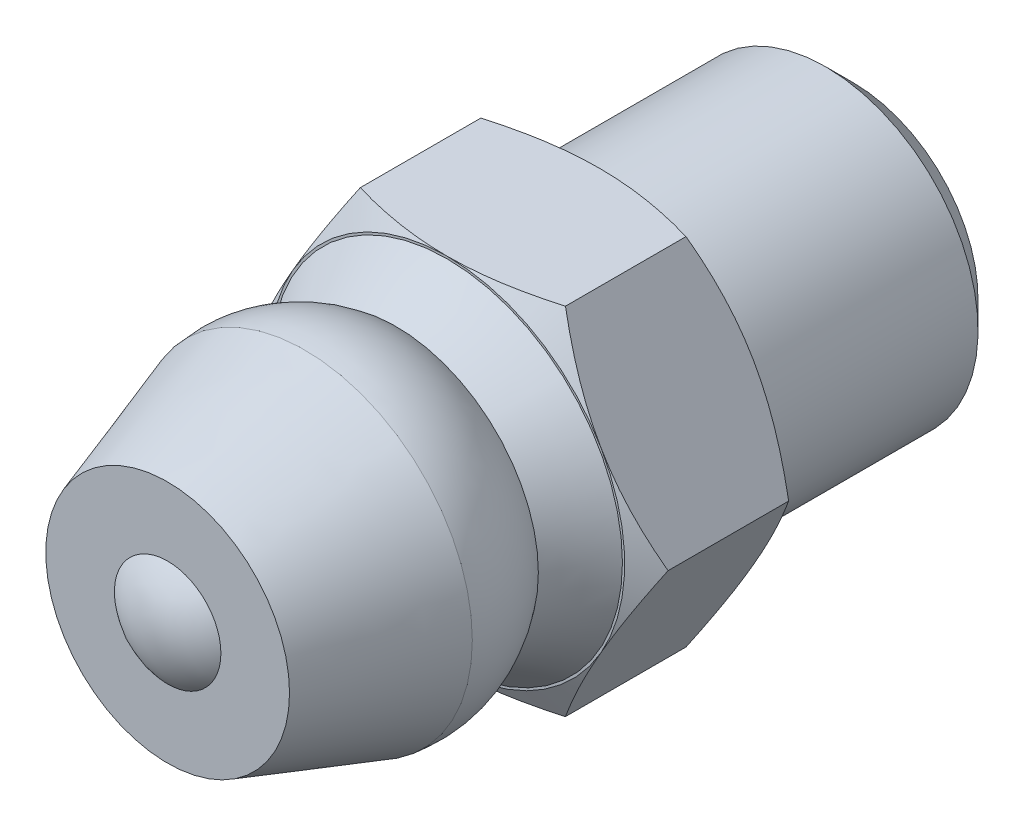
ISO-10303-21;
HEADER;
FILE_DESCRIPTION(('STEP AP214'),'2;1');
FILE_NAME('part.step','',(''),(''),'','','');
FILE_SCHEMA(('AUTOMOTIVE_DESIGN { 1 0 10303 214 1 1 1 1 }'));
ENDSEC;
DATA;
#1=APPLICATION_CONTEXT('core data for automotive mechanical design processes');
#2=APPLICATION_PROTOCOL_DEFINITION('international standard','automotive_design',2000,#1);
#3=PRODUCT_CONTEXT('',#1,'mechanical');
#4=PRODUCT('Part','Part','',(#3));
#5=PRODUCT_RELATED_PRODUCT_CATEGORY('part','',(#4));
#6=PRODUCT_DEFINITION_FORMATION('','',#4);
#7=PRODUCT_DEFINITION_CONTEXT('part definition',#1,'design');
#8=PRODUCT_DEFINITION('design','',#6,#7);
#9=PRODUCT_DEFINITION_SHAPE('','',#8);
#10=(LENGTH_UNIT() NAMED_UNIT(*) SI_UNIT(.MILLI.,.METRE.));
#11=(NAMED_UNIT(*) PLANE_ANGLE_UNIT() SI_UNIT($,.RADIAN.));
#12=(NAMED_UNIT(*) SI_UNIT($,.STERADIAN.) SOLID_ANGLE_UNIT());
#13=UNCERTAINTY_MEASURE_WITH_UNIT(LENGTH_MEASURE(1.E-05),#10,'distance_accuracy_value','');
#14=(GEOMETRIC_REPRESENTATION_CONTEXT(3) GLOBAL_UNCERTAINTY_ASSIGNED_CONTEXT((#13)) GLOBAL_UNIT_ASSIGNED_CONTEXT((#10,
#11,#12)) REPRESENTATION_CONTEXT('',''));
#15=CARTESIAN_POINT('',(0.,0.,0.));
#16=DIRECTION('',(0.,0.,1.));
#17=DIRECTION('',(1.,0.,0.));
#18=AXIS2_PLACEMENT_3D('',#15,#16,#17);
#19=CARTESIAN_POINT('',(1.06929823484246,2.9054569289654E-06,0.813410503438907));
#20=DIRECTION('',(0.,0.,-1.));
#21=DIRECTION('',(0.,1.,0.));
#22=AXIS2_PLACEMENT_3D('',#19,#20,#21);
#23=PLANE('',#22);
#24=CARTESIAN_POINT('',(-2.57621915747012E-06,2.9054569289654E-06,0.813410503438907));
#25=DIRECTION('',(0.,0.,-1.));
#26=DIRECTION('',(1.,0.,0.));
#27=AXIS2_PLACEMENT_3D('',#24,#25,#26);
#28=CIRCLE('',#27,1.85208333333333);
#29=CARTESIAN_POINT('',(-1.60395379281159,0.926044572123596,0.813410503438907));
#30=VERTEX_POINT('',#29);
#31=CARTESIAN_POINT('',(-2.57621915747012E-06,1.85208623879026,0.813410503438907));
#32=VERTEX_POINT('',#31);
#33=EDGE_CURVE('E250',#30,#32,#28,.T.);
#34=ORIENTED_EDGE('',*,*,#33,.T.);
#35=CARTESIAN_POINT('',(-2.57621915747012E-06,2.9054569289654E-06,0.813410503438907));
#36=DIRECTION('',(0.,0.,-1.));
#37=DIRECTION('',(1.,0.,0.));
#38=AXIS2_PLACEMENT_3D('',#35,#36,#37);
#39=CIRCLE('',#38,1.85208333333333);
#40=CARTESIAN_POINT('',(1.60394864037327,0.926044572123596,0.813410503438907));
#41=VERTEX_POINT('',#40);
#42=EDGE_CURVE('E421',#32,#41,#39,.T.);
#43=ORIENTED_EDGE('',*,*,#42,.T.);
#44=CARTESIAN_POINT('',(-2.57621915747012E-06,2.9054569289654E-06,0.813410503438907));
#45=DIRECTION('',(0.,0.,-1.));
#46=DIRECTION('',(1.,0.,0.));
#47=AXIS2_PLACEMENT_3D('',#44,#45,#46);
#48=CIRCLE('',#47,1.85208333333333);
#49=CARTESIAN_POINT('',(1.60394864037327,-0.92603876120974,0.813410503438907));
#50=VERTEX_POINT('',#49);
#51=EDGE_CURVE('E382',#41,#50,#48,.T.);
#52=ORIENTED_EDGE('',*,*,#51,.T.);
#53=CARTESIAN_POINT('',(-2.57621915747012E-06,2.9054569289654E-06,0.813410503438907));
#54=DIRECTION('',(0.,0.,-1.));
#55=DIRECTION('',(1.,0.,0.));
#56=AXIS2_PLACEMENT_3D('',#53,#54,#55);
#57=CIRCLE('',#56,1.85208333333333);
#58=CARTESIAN_POINT('',(-2.57621915769693E-06,-1.8520804278764,0.813410503438907));
#59=VERTEX_POINT('',#58);
#60=EDGE_CURVE('E206',#50,#59,#57,.T.);
#61=ORIENTED_EDGE('',*,*,#60,.T.);
#62=CARTESIAN_POINT('',(-2.57621915747012E-06,2.9054569289654E-06,0.813410503438907));
#63=DIRECTION('',(0.,0.,-1.));
#64=DIRECTION('',(1.,0.,0.));
#65=AXIS2_PLACEMENT_3D('',#62,#63,#64);
#66=CIRCLE('',#65,1.85208333333333);
#67=CARTESIAN_POINT('',(-1.60395379281159,-0.926038761209737,0.813410503438907));
#68=VERTEX_POINT('',#67);
#69=EDGE_CURVE('E186',#59,#68,#66,.T.);
#70=ORIENTED_EDGE('',*,*,#69,.T.);
#71=CARTESIAN_POINT('',(-2.57621915747012E-06,2.9054569289654E-06,0.813410503438907));
#72=DIRECTION('',(0.,0.,-1.));
#73=DIRECTION('',(1.,0.,0.));
#74=AXIS2_PLACEMENT_3D('',#71,#72,#73);
#75=CIRCLE('',#74,1.85208333333333);
#76=EDGE_CURVE('E181',#68,#30,#75,.T.);
#77=ORIENTED_EDGE('',*,*,#76,.T.);
#78=EDGE_LOOP('',(#34,#43,#52,#61,#70,#77));
#79=FACE_BOUND('',#78,.T.);
#80=CARTESIAN_POINT('',(-2.57621915747012E-06,2.9054569289654E-06,0.813410503438907));
#81=DIRECTION('',(0.,0.,-1.));
#82=DIRECTION('',(0.,1.,0.));
#83=AXIS2_PLACEMENT_3D('',#80,#81,#82);
#84=CIRCLE('',#83,1.5875);
#85=CARTESIAN_POINT('',(-2.57621915747012E-06,1.58750290545693,0.813410503438907));
#86=VERTEX_POINT('',#85);
#87=EDGE_CURVE('E449',#86,#86,#84,.T.);
#88=ORIENTED_EDGE('',*,*,#87,.F.);
#89=EDGE_LOOP('',(#88));
#90=FACE_BOUND('',#89,.T.);
#91=ADVANCED_FACE('F44',(#79,#90),#23,.T.);
#92=CARTESIAN_POINT('',(1.06929823484246,2.9054569290626E-06,2.40091050343891));
#93=DIRECTION('',(0.,0.,1.));
#94=DIRECTION('',(0.,-1.,0.));
#95=AXIS2_PLACEMENT_3D('',#92,#93,#94);
#96=PLANE('',#95);
#97=CARTESIAN_POINT('',(-2.57621915747012E-06,2.9054569289654E-06,2.40091050343891));
#98=DIRECTION('',(0.,0.,1.));
#99=DIRECTION('',(-1.,0.,0.));
#100=AXIS2_PLACEMENT_3D('',#97,#98,#99);
#101=CIRCLE('',#100,1.85208333333333);
#102=CARTESIAN_POINT('',(-2.57621915747012E-06,1.85208623879026,2.40091050343891));
#103=VERTEX_POINT('',#102);
#104=CARTESIAN_POINT('',(-1.60395379281159,0.926044572123596,2.40091050343891));
#105=VERTEX_POINT('',#104);
#106=EDGE_CURVE('E187',#103,#105,#101,.T.);
#107=ORIENTED_EDGE('',*,*,#106,.T.);
#108=CARTESIAN_POINT('',(-2.57621915747012E-06,2.9054569289654E-06,2.40091050343891));
#109=DIRECTION('',(0.,0.,1.));
#110=DIRECTION('',(-1.,0.,0.));
#111=AXIS2_PLACEMENT_3D('',#108,#109,#110);
#112=CIRCLE('',#111,1.85208333333333);
#113=CARTESIAN_POINT('',(-1.60395379281159,-0.926038761209737,2.40091050343891));
#114=VERTEX_POINT('',#113);
#115=EDGE_CURVE('E215',#105,#114,#112,.T.);
#116=ORIENTED_EDGE('',*,*,#115,.T.);
#117=CARTESIAN_POINT('',(-2.57621915747012E-06,2.9054569289654E-06,2.40091050343891));
#118=DIRECTION('',(0.,0.,1.));
#119=DIRECTION('',(-1.,0.,0.));
#120=AXIS2_PLACEMENT_3D('',#117,#118,#119);
#121=CIRCLE('',#120,1.85208333333333);
#122=CARTESIAN_POINT('',(-2.57621915769693E-06,-1.8520804278764,2.40091050343891));
#123=VERTEX_POINT('',#122);
#124=EDGE_CURVE('E266',#114,#123,#121,.T.);
#125=ORIENTED_EDGE('',*,*,#124,.T.);
#126=CARTESIAN_POINT('',(-2.57621915747012E-06,2.9054569289654E-06,2.40091050343891));
#127=DIRECTION('',(0.,0.,1.));
#128=DIRECTION('',(-1.,0.,0.));
#129=AXIS2_PLACEMENT_3D('',#126,#127,#128);
#130=CIRCLE('',#129,1.85208333333333);
#131=CARTESIAN_POINT('',(1.60394864037327,-0.92603876120974,2.40091050343891));
#132=VERTEX_POINT('',#131);
#133=EDGE_CURVE('E249',#123,#132,#130,.T.);
#134=ORIENTED_EDGE('',*,*,#133,.T.);
#135=CARTESIAN_POINT('',(-2.57621915747012E-06,2.9054569289654E-06,2.40091050343891));
#136=DIRECTION('',(0.,0.,1.));
#137=DIRECTION('',(-1.,0.,0.));
#138=AXIS2_PLACEMENT_3D('',#135,#136,#137);
#139=CIRCLE('',#138,1.85208333333333);
#140=CARTESIAN_POINT('',(1.60394864037327,0.926044572123596,2.40091050343891));
#141=VERTEX_POINT('',#140);
#142=EDGE_CURVE('E241',#132,#141,#139,.T.);
#143=ORIENTED_EDGE('',*,*,#142,.T.);
#144=CARTESIAN_POINT('',(-2.57621915747012E-06,2.9054569289654E-06,2.40091050343891));
#145=DIRECTION('',(0.,0.,1.));
#146=DIRECTION('',(-1.,0.,0.));
#147=AXIS2_PLACEMENT_3D('',#144,#145,#146);
#148=CIRCLE('',#147,1.85208333333333);
#149=EDGE_CURVE('E156',#141,#103,#148,.T.);
#150=ORIENTED_EDGE('',*,*,#149,.T.);
#151=EDGE_LOOP('',(#107,#116,#125,#134,#143,#150));
#152=FACE_BOUND('',#151,.T.);
#153=CARTESIAN_POINT('',(-2.57621915747012E-06,2.90545692877423E-06,2.40091050343891));
#154=DIRECTION('',(0.,0.,-1.));
#155=DIRECTION('',(-1.,0.,0.));
#156=AXIS2_PLACEMENT_3D('',#153,#154,#155);
#157=CIRCLE('',#156,1.82876519948076);
#158=CARTESIAN_POINT('',(-1.82876777569991,2.90545692877423E-06,2.40091050343891));
#159=VERTEX_POINT('',#158);
#160=EDGE_CURVE('E165',#159,#159,#157,.T.);
#161=ORIENTED_EDGE('',*,*,#160,.T.);
#162=EDGE_LOOP('',(#161));
#163=FACE_BOUND('',#162,.T.);
#164=ADVANCED_FACE('F522',(#152,#163),#96,.T.);
#165=CARTESIAN_POINT('',(-2.57621915747012E-06,1.85208623879026,1.60716050343891));
#166=DIRECTION('',(0.,1.,0.));
#167=DIRECTION('',(0.,0.,1.));
#168=AXIS2_PLACEMENT_3D('',#165,#166,#167);
#169=PLANE('',#168);
#170=CARTESIAN_POINT('',(-2.07069469288303,1.85208623879026,1.8662600979081));
#171=CARTESIAN_POINT('',(-0.828279422884707,1.85208623879026,2.40091050343891));
#172=CARTESIAN_POINT('',(-2.57621915747012E-06,1.85208623879026,2.40091050343891));
#173=CARTESIAN_POINT('',(0.828274270446392,1.85208623879026,2.40091050343891));
#174=CARTESIAN_POINT('',(2.07068954044471,1.85208623879026,1.8662600979081));
#175=(BOUNDED_CURVE() B_SPLINE_CURVE(2,(#170,#171,#172,#173,#174),.UNSPECIFIED.,.F.,
.F.) B_SPLINE_CURVE_WITH_KNOTS((3,2,3),(0.,4.06287989998549,8.12575979997098),
.UNSPECIFIED.) CURVE() GEOMETRIC_REPRESENTATION_ITEM() RATIONAL_B_SPLINE_CURVE((1.,
1.1180339887499,1.,1.1180339887499,1.)) REPRESENTATION_ITEM(''));
#176=CARTESIAN_POINT('',(1.06929823484246,1.85208623879026,2.2354890922783));
#177=VERTEX_POINT('',#176);
#178=EDGE_CURVE('E154',#103,#177,#175,.T.);
#179=ORIENTED_EDGE('',*,*,#178,.T.);
#180=DIRECTION('',(0.,0.,1.));
#181=VECTOR('',#180,1.);
#182=CARTESIAN_POINT('',(1.06929823484246,1.85208623879026,1.60716050343891));
#183=LINE('',#182,#181);
#184=CARTESIAN_POINT('',(1.06929823484246,1.85208623879026,0.978831914599509));
#185=VERTEX_POINT('',#184);
#186=EDGE_CURVE('E158',#185,#177,#183,.T.);
#187=ORIENTED_EDGE('',*,*,#186,.F.);
#188=CARTESIAN_POINT('',(2.07068954044471,1.85208623879026,1.34806090896972));
#189=CARTESIAN_POINT('',(0.828274270446389,1.85208623879026,0.813410503438907));
#190=CARTESIAN_POINT('',(-2.57621915747012E-06,1.85208623879026,0.813410503438907));
#191=CARTESIAN_POINT('',(-0.828279422884704,1.85208623879026,0.813410503438907));
#192=CARTESIAN_POINT('',(-2.07069469288302,1.85208623879026,1.34806090896972));
#193=(BOUNDED_CURVE() B_SPLINE_CURVE(2,(#188,#189,#190,#191,#192),.UNSPECIFIED.,.F.,
.F.) B_SPLINE_CURVE_WITH_KNOTS((3,2,3),(0.,4.06287989998548,8.12575979997097),
.UNSPECIFIED.) CURVE() GEOMETRIC_REPRESENTATION_ITEM() RATIONAL_B_SPLINE_CURVE((1.,
1.1180339887499,1.,1.1180339887499,1.)) REPRESENTATION_ITEM(''));
#194=EDGE_CURVE('E61',#185,#32,#193,.T.);
#195=ORIENTED_EDGE('',*,*,#194,.T.);
#196=CARTESIAN_POINT('',(2.07068954044471,1.85208623879026,1.34806090896972));
#197=CARTESIAN_POINT('',(0.828274270446389,1.85208623879026,0.813410503438907));
#198=CARTESIAN_POINT('',(-2.57621915747012E-06,1.85208623879026,0.813410503438907));
#199=CARTESIAN_POINT('',(-0.828279422884704,1.85208623879026,0.813410503438907));
#200=CARTESIAN_POINT('',(-2.07069469288302,1.85208623879026,1.34806090896972));
#201=(BOUNDED_CURVE() B_SPLINE_CURVE(2,(#196,#197,#198,#199,#200),.UNSPECIFIED.,.F.,
.F.) B_SPLINE_CURVE_WITH_KNOTS((3,2,3),(0.,4.06287989998548,8.12575979997097),
.UNSPECIFIED.) CURVE() GEOMETRIC_REPRESENTATION_ITEM() RATIONAL_B_SPLINE_CURVE((1.,
1.1180339887499,1.,1.1180339887499,1.)) REPRESENTATION_ITEM(''));
#202=CARTESIAN_POINT('',(-1.06930338728078,1.85208623879026,0.978831914599509));
#203=VERTEX_POINT('',#202);
#204=EDGE_CURVE('E344',#32,#203,#201,.T.);
#205=ORIENTED_EDGE('',*,*,#204,.T.);
#206=DIRECTION('',(0.,0.,-1.));
#207=VECTOR('',#206,1.);
#208=CARTESIAN_POINT('',(-1.06930338728078,1.85208623879026,1.60716050343891));
#209=LINE('',#208,#207);
#210=CARTESIAN_POINT('',(-1.06930338728078,1.85208623879026,2.2354890922783));
#211=VERTEX_POINT('',#210);
#212=EDGE_CURVE('E472',#211,#203,#209,.T.);
#213=ORIENTED_EDGE('',*,*,#212,.F.);
#214=CARTESIAN_POINT('',(-2.07069469288303,1.85208623879026,1.8662600979081));
#215=CARTESIAN_POINT('',(-0.828279422884707,1.85208623879026,2.40091050343891));
#216=CARTESIAN_POINT('',(-2.57621915747012E-06,1.85208623879026,2.40091050343891));
#217=CARTESIAN_POINT('',(0.828274270446392,1.85208623879026,2.40091050343891));
#218=CARTESIAN_POINT('',(2.07068954044471,1.85208623879026,1.8662600979081));
#219=(BOUNDED_CURVE() B_SPLINE_CURVE(2,(#214,#215,#216,#217,#218),.UNSPECIFIED.,.F.,
.F.) B_SPLINE_CURVE_WITH_KNOTS((3,2,3),(0.,4.06287989998549,8.12575979997098),
.UNSPECIFIED.) CURVE() GEOMETRIC_REPRESENTATION_ITEM() RATIONAL_B_SPLINE_CURVE((1.,
1.1180339887499,1.,1.1180339887499,1.)) REPRESENTATION_ITEM(''));
#220=EDGE_CURVE('E163',#211,#103,#219,.T.);
#221=ORIENTED_EDGE('',*,*,#220,.T.);
#222=EDGE_LOOP('',(#179,#187,#195,#205,#213,#221));
#223=FACE_BOUND('',#222,.T.);
#224=ADVANCED_FACE('F161',(#223),#169,.T.);
#225=CARTESIAN_POINT('',(1.60394864037327,0.926044572123596,1.60716050343891));
#226=DIRECTION('',(0.866025403784439,0.5,0.));
#227=DIRECTION('',(-0.5,0.866025403784439,0.));
#228=AXIS2_PLACEMENT_3D('',#225,#226,#227);
#229=PLANE('',#228);
#230=CARTESIAN_POINT('',(0.568602582041337,2.71931654857068,1.8662600979081));
#231=CARTESIAN_POINT('',(1.1898102170405,1.64335336270243,2.40091050343891));
#232=CARTESIAN_POINT('',(1.60394864037327,0.926044572123596,2.40091050343891));
#233=CARTESIAN_POINT('',(2.01808706370605,0.208735781544763,2.40091050343891));
#234=CARTESIAN_POINT('',(2.63929469870521,-0.867227404323486,1.8662600979081));
#235=(BOUNDED_CURVE() B_SPLINE_CURVE(2,(#230,#231,#232,#233,#234),.UNSPECIFIED.,.F.,
.F.) B_SPLINE_CURVE_WITH_KNOTS((3,2,3),(0.,4.06287989998549,8.12575979997098),
.UNSPECIFIED.) CURVE() GEOMETRIC_REPRESENTATION_ITEM() RATIONAL_B_SPLINE_CURVE((1.,
1.11803398874989,1.,1.1180339887499,1.)) REPRESENTATION_ITEM(''));
#236=CARTESIAN_POINT('',(2.13859904590408,2.90545692500892E-06,2.2354890922783));
#237=VERTEX_POINT('',#236);
#238=EDGE_CURVE('E345',#141,#237,#235,.T.);
#239=ORIENTED_EDGE('',*,*,#238,.T.);
#240=DIRECTION('',(0.,0.,-1.));
#241=VECTOR('',#240,1.);
#242=CARTESIAN_POINT('',(2.13859904590408,2.90545692497044E-06,1.60716050343891));
#243=LINE('',#242,#241);
#244=CARTESIAN_POINT('',(2.13859904590408,2.90545692493197E-06,0.978831914599509));
#245=VERTEX_POINT('',#244);
#246=EDGE_CURVE('E359',#237,#245,#243,.T.);
#247=ORIENTED_EDGE('',*,*,#246,.T.);
#248=CARTESIAN_POINT('',(2.63929469870521,-0.867227404323485,1.34806090896972));
#249=CARTESIAN_POINT('',(2.01808706370605,0.208735781544763,0.813410503438907));
#250=CARTESIAN_POINT('',(1.60394864037327,0.926044572123596,0.813410503438907));
#251=CARTESIAN_POINT('',(1.1898102170405,1.64335336270243,0.813410503438907));
#252=CARTESIAN_POINT('',(0.568602582041338,2.71931654857068,1.34806090896972));
#253=(BOUNDED_CURVE() B_SPLINE_CURVE(2,(#248,#249,#250,#251,#252),.UNSPECIFIED.,.F.,
.F.) B_SPLINE_CURVE_WITH_KNOTS((3,2,3),(0.,4.06287989998549,8.12575979997097),
.UNSPECIFIED.) CURVE() GEOMETRIC_REPRESENTATION_ITEM() RATIONAL_B_SPLINE_CURVE((1.,
1.1180339887499,1.,1.1180339887499,1.)) REPRESENTATION_ITEM(''));
#254=EDGE_CURVE('E172',#245,#41,#253,.T.);
#255=ORIENTED_EDGE('',*,*,#254,.T.);
#256=CARTESIAN_POINT('',(2.63929469870521,-0.867227404323485,1.34806090896972));
#257=CARTESIAN_POINT('',(2.01808706370605,0.208735781544763,0.813410503438907));
#258=CARTESIAN_POINT('',(1.60394864037327,0.926044572123596,0.813410503438907));
#259=CARTESIAN_POINT('',(1.1898102170405,1.64335336270243,0.813410503438907));
#260=CARTESIAN_POINT('',(0.568602582041338,2.71931654857068,1.34806090896972));
#261=(BOUNDED_CURVE() B_SPLINE_CURVE(2,(#256,#257,#258,#259,#260),.UNSPECIFIED.,.F.,
.F.) B_SPLINE_CURVE_WITH_KNOTS((3,2,3),(0.,4.06287989998549,8.12575979997097),
.UNSPECIFIED.) CURVE() GEOMETRIC_REPRESENTATION_ITEM() RATIONAL_B_SPLINE_CURVE((1.,
1.1180339887499,1.,1.1180339887499,1.)) REPRESENTATION_ITEM(''));
#262=EDGE_CURVE('E148',#41,#185,#261,.T.);
#263=ORIENTED_EDGE('',*,*,#262,.T.);
#264=ORIENTED_EDGE('',*,*,#186,.T.);
#265=CARTESIAN_POINT('',(0.568602582041337,2.71931654857068,1.8662600979081));
#266=CARTESIAN_POINT('',(1.1898102170405,1.64335336270243,2.40091050343891));
#267=CARTESIAN_POINT('',(1.60394864037327,0.926044572123596,2.40091050343891));
#268=CARTESIAN_POINT('',(2.01808706370605,0.208735781544763,2.40091050343891));
#269=CARTESIAN_POINT('',(2.63929469870521,-0.867227404323486,1.8662600979081));
#270=(BOUNDED_CURVE() B_SPLINE_CURVE(2,(#265,#266,#267,#268,#269),.UNSPECIFIED.,.F.,
.F.) B_SPLINE_CURVE_WITH_KNOTS((3,2,3),(0.,4.06287989998549,8.12575979997098),
.UNSPECIFIED.) CURVE() GEOMETRIC_REPRESENTATION_ITEM() RATIONAL_B_SPLINE_CURVE((1.,
1.11803398874989,1.,1.1180339887499,1.)) REPRESENTATION_ITEM(''));
#271=EDGE_CURVE('E142',#177,#141,#270,.T.);
#272=ORIENTED_EDGE('',*,*,#271,.T.);
#273=EDGE_LOOP('',(#239,#247,#255,#263,#264,#272));
#274=FACE_BOUND('',#273,.T.);
#275=ADVANCED_FACE('F167',(#274),#229,.T.);
#276=CARTESIAN_POINT('',(1.60394864037327,-0.92603876120974,1.60716050343891));
#277=DIRECTION('',(0.866025403784438,-0.500000000000001,0.));
#278=DIRECTION('',(0.500000000000001,0.866025403784438,0.));
#279=AXIS2_PLACEMENT_3D('',#276,#277,#278);
#280=PLANE('',#279);
#281=CARTESIAN_POINT('',(2.63929469870521,0.86723321523734,1.8662600979081));
#282=CARTESIAN_POINT('',(2.01808706370604,-0.208729970630909,2.40091050343891));
#283=CARTESIAN_POINT('',(1.60394864037327,-0.92603876120974,2.40091050343891));
#284=CARTESIAN_POINT('',(1.1898102170405,-1.64334755178857,2.40091050343891));
#285=CARTESIAN_POINT('',(0.568602582041334,-2.71931073765682,1.8662600979081));
#286=(BOUNDED_CURVE() B_SPLINE_CURVE(2,(#281,#282,#283,#284,#285),.UNSPECIFIED.,.F.,
.F.) B_SPLINE_CURVE_WITH_KNOTS((3,2,3),(0.,4.06287989998549,8.12575979997098),
.UNSPECIFIED.) CURVE() GEOMETRIC_REPRESENTATION_ITEM() RATIONAL_B_SPLINE_CURVE((1.,
1.11803398874989,1.,1.11803398874989,1.)) REPRESENTATION_ITEM(''));
#287=CARTESIAN_POINT('',(1.06929823484246,-1.8520804278764,2.2354890922783));
#288=VERTEX_POINT('',#287);
#289=EDGE_CURVE('E159',#132,#288,#286,.T.);
#290=ORIENTED_EDGE('',*,*,#289,.T.);
#291=DIRECTION('',(0.,0.,-1.));
#292=VECTOR('',#291,1.);
#293=CARTESIAN_POINT('',(1.06929823484246,-1.8520804278764,1.60716050343891));
#294=LINE('',#293,#292);
#295=CARTESIAN_POINT('',(1.06929823484246,-1.8520804278764,0.978831914599509));
#296=VERTEX_POINT('',#295);
#297=EDGE_CURVE('E297',#288,#296,#294,.T.);
#298=ORIENTED_EDGE('',*,*,#297,.T.);
#299=CARTESIAN_POINT('',(0.568602582041334,-2.71931073765682,1.34806090896972));
#300=CARTESIAN_POINT('',(1.1898102170405,-1.64334755178857,0.813410503438907));
#301=CARTESIAN_POINT('',(1.60394864037327,-0.92603876120974,0.813410503438907));
#302=CARTESIAN_POINT('',(2.01808706370605,-0.208729970630907,0.813410503438907));
#303=CARTESIAN_POINT('',(2.63929469870521,0.867233215237339,1.34806090896972));
#304=(BOUNDED_CURVE() B_SPLINE_CURVE(2,(#299,#300,#301,#302,#303),.UNSPECIFIED.,.F.,
.F.) B_SPLINE_CURVE_WITH_KNOTS((3,2,3),(0.,4.06287989998549,8.12575979997098),
.UNSPECIFIED.) CURVE() GEOMETRIC_REPRESENTATION_ITEM() RATIONAL_B_SPLINE_CURVE((1.,
1.1180339887499,1.,1.11803398874989,1.)) REPRESENTATION_ITEM(''));
#305=EDGE_CURVE('E292',#296,#50,#304,.T.);
#306=ORIENTED_EDGE('',*,*,#305,.T.);
#307=CARTESIAN_POINT('',(0.568602582041334,-2.71931073765682,1.34806090896972));
#308=CARTESIAN_POINT('',(1.1898102170405,-1.64334755178857,0.813410503438907));
#309=CARTESIAN_POINT('',(1.60394864037327,-0.92603876120974,0.813410503438907));
#310=CARTESIAN_POINT('',(2.01808706370605,-0.208729970630907,0.813410503438907));
#311=CARTESIAN_POINT('',(2.63929469870521,0.867233215237339,1.34806090896972));
#312=(BOUNDED_CURVE() B_SPLINE_CURVE(2,(#307,#308,#309,#310,#311),.UNSPECIFIED.,.F.,
.F.) B_SPLINE_CURVE_WITH_KNOTS((3,2,3),(0.,4.06287989998549,8.12575979997098),
.UNSPECIFIED.) CURVE() GEOMETRIC_REPRESENTATION_ITEM() RATIONAL_B_SPLINE_CURVE((1.,
1.1180339887499,1.,1.11803398874989,1.)) REPRESENTATION_ITEM(''));
#313=EDGE_CURVE('E298',#50,#245,#312,.T.);
#314=ORIENTED_EDGE('',*,*,#313,.T.);
#315=ORIENTED_EDGE('',*,*,#246,.F.);
#316=CARTESIAN_POINT('',(2.63929469870521,0.86723321523734,1.8662600979081));
#317=CARTESIAN_POINT('',(2.01808706370604,-0.208729970630909,2.40091050343891));
#318=CARTESIAN_POINT('',(1.60394864037327,-0.92603876120974,2.40091050343891));
#319=CARTESIAN_POINT('',(1.1898102170405,-1.64334755178857,2.40091050343891));
#320=CARTESIAN_POINT('',(0.568602582041334,-2.71931073765682,1.8662600979081));
#321=(BOUNDED_CURVE() B_SPLINE_CURVE(2,(#316,#317,#318,#319,#320),.UNSPECIFIED.,.F.,
.F.) B_SPLINE_CURVE_WITH_KNOTS((3,2,3),(0.,4.06287989998549,8.12575979997098),
.UNSPECIFIED.) CURVE() GEOMETRIC_REPRESENTATION_ITEM() RATIONAL_B_SPLINE_CURVE((1.,
1.11803398874989,1.,1.11803398874989,1.)) REPRESENTATION_ITEM(''));
#322=EDGE_CURVE('E135',#237,#132,#321,.T.);
#323=ORIENTED_EDGE('',*,*,#322,.T.);
#324=EDGE_LOOP('',(#290,#298,#306,#314,#315,#323));
#325=FACE_BOUND('',#324,.T.);
#326=ADVANCED_FACE('F540',(#325),#280,.T.);
#327=DIRECTION('',(-0.866025403784439,0.,-0.5));
#328=VECTOR('',#327,1.);
#329=CARTESIAN_POINT('',(264054.16666409,2.90546626356865E-06,152451.488315335));
#330=LINE('',#329,#328);
#331=CARTESIAN_POINT('',(-2.57621915747012E-06,2.90545692889992E-06,-0.255890307622713));
#332=DIRECTION('',(0.,0.,1.));
#333=AXIS1_PLACEMENT('',#331,#332);
#334=SURFACE_OF_REVOLUTION('',#330,#333);
#335=ORIENTED_EDGE('',*,*,#204,.F.);
#336=ORIENTED_EDGE('',*,*,#33,.F.);
#337=CARTESIAN_POINT('',(-0.568607734479653,2.71931654857068,1.34806090896972));
#338=CARTESIAN_POINT('',(-1.18981536947881,1.64335336270243,0.813410503438907));
#339=CARTESIAN_POINT('',(-1.60395379281159,0.926044572123596,0.813410503438907));
#340=CARTESIAN_POINT('',(-2.01809221614436,0.208735781544763,0.813410503438907));
#341=CARTESIAN_POINT('',(-2.63929985114352,-0.867227404323485,1.34806090896972));
#342=(BOUNDED_CURVE() B_SPLINE_CURVE(2,(#337,#338,#339,#340,#341),.UNSPECIFIED.,.F.,
.F.) B_SPLINE_CURVE_WITH_KNOTS((3,2,3),(0.,4.06287989998548,8.12575979997097),
.UNSPECIFIED.) CURVE() GEOMETRIC_REPRESENTATION_ITEM() RATIONAL_B_SPLINE_CURVE((1.,
1.1180339887499,1.,1.1180339887499,1.)) REPRESENTATION_ITEM(''));
#343=EDGE_CURVE('E299',#203,#30,#342,.T.);
#344=ORIENTED_EDGE('',*,*,#343,.F.);
#345=EDGE_LOOP('',(#335,#336,#344));
#346=FACE_BOUND('',#345,.T.);
#347=ADVANCED_FACE('F543',(#346),#334,.F.);
#348=DIRECTION('',(-0.866025403784439,0.,-0.5));
#349=VECTOR('',#348,1.);
#350=CARTESIAN_POINT('',(264054.16666409,2.90546626356865E-06,152451.488315335));
#351=LINE('',#350,#349);
#352=CARTESIAN_POINT('',(-2.57621915747012E-06,2.90545692889992E-06,-0.255890307622713));
#353=DIRECTION('',(0.,0.,1.));
#354=AXIS1_PLACEMENT('',#352,#353);
#355=SURFACE_OF_REVOLUTION('',#351,#354);
#356=ORIENTED_EDGE('',*,*,#262,.F.);
#357=ORIENTED_EDGE('',*,*,#42,.F.);
#358=ORIENTED_EDGE('',*,*,#194,.F.);
#359=EDGE_LOOP('',(#356,#357,#358));
#360=FACE_BOUND('',#359,.T.);
#361=ADVANCED_FACE('F548',(#360),#355,.F.);
#362=DIRECTION('',(-0.866025403784439,0.,-0.5));
#363=VECTOR('',#362,1.);
#364=CARTESIAN_POINT('',(264054.16666409,2.90546626356865E-06,152451.488315335));
#365=LINE('',#364,#363);
#366=CARTESIAN_POINT('',(-2.57621915747012E-06,2.90545692889992E-06,-0.255890307622713));
#367=DIRECTION('',(0.,0.,1.));
#368=AXIS1_PLACEMENT('',#366,#367);
#369=SURFACE_OF_REVOLUTION('',#365,#368);
#370=ORIENTED_EDGE('',*,*,#313,.F.);
#371=ORIENTED_EDGE('',*,*,#51,.F.);
#372=ORIENTED_EDGE('',*,*,#254,.F.);
#373=EDGE_LOOP('',(#370,#371,#372));
#374=FACE_BOUND('',#373,.T.);
#375=ADVANCED_FACE('F567',(#374),#369,.F.);
#376=DIRECTION('',(-0.866025403784439,0.,-0.5));
#377=VECTOR('',#376,1.);
#378=CARTESIAN_POINT('',(264054.16666409,2.90546626356865E-06,152451.488315335));
#379=LINE('',#378,#377);
#380=CARTESIAN_POINT('',(-2.57621915747012E-06,2.90545692889992E-06,-0.255890307622713));
#381=DIRECTION('',(0.,0.,1.));
#382=AXIS1_PLACEMENT('',#380,#381);
#383=SURFACE_OF_REVOLUTION('',#379,#382);
#384=ORIENTED_EDGE('',*,*,#305,.F.);
#385=CARTESIAN_POINT('',(-2.07069469288303,-1.8520804278764,1.34806090896972));
#386=CARTESIAN_POINT('',(-0.828279422884706,-1.8520804278764,0.813410503438907));
#387=CARTESIAN_POINT('',(-2.57621915769693E-06,-1.8520804278764,0.813410503438907));
#388=CARTESIAN_POINT('',(0.828274270446389,-1.8520804278764,0.813410503438907));
#389=CARTESIAN_POINT('',(2.07068954044471,-1.8520804278764,1.34806090896972));
#390=(BOUNDED_CURVE() B_SPLINE_CURVE(2,(#385,#386,#387,#388,#389),.UNSPECIFIED.,.F.,
.F.) B_SPLINE_CURVE_WITH_KNOTS((3,2,3),(0.,4.06287989998549,8.12575979997097),
.UNSPECIFIED.) CURVE() GEOMETRIC_REPRESENTATION_ITEM() RATIONAL_B_SPLINE_CURVE((1.,
1.11803398874989,1.,1.1180339887499,1.)) REPRESENTATION_ITEM(''));
#391=EDGE_CURVE('E322',#59,#296,#390,.T.);
#392=ORIENTED_EDGE('',*,*,#391,.F.);
#393=ORIENTED_EDGE('',*,*,#60,.F.);
#394=EDGE_LOOP('',(#384,#392,#393));
#395=FACE_BOUND('',#394,.T.);
#396=ADVANCED_FACE('F571',(#395),#383,.F.);
#397=DIRECTION('',(-0.866025403784439,0.,-0.5));
#398=VECTOR('',#397,1.);
#399=CARTESIAN_POINT('',(264054.16666409,2.90546626356865E-06,152451.488315335));
#400=LINE('',#399,#398);
#401=CARTESIAN_POINT('',(-2.57621915747012E-06,2.90545692889992E-06,-0.255890307622713));
#402=DIRECTION('',(0.,0.,1.));
#403=AXIS1_PLACEMENT('',#401,#402);
#404=SURFACE_OF_REVOLUTION('',#400,#403);
#405=CARTESIAN_POINT('',(-2.07069469288303,-1.8520804278764,1.34806090896972));
#406=CARTESIAN_POINT('',(-0.828279422884706,-1.8520804278764,0.813410503438907));
#407=CARTESIAN_POINT('',(-2.57621915769693E-06,-1.8520804278764,0.813410503438907));
#408=CARTESIAN_POINT('',(0.828274270446389,-1.8520804278764,0.813410503438907));
#409=CARTESIAN_POINT('',(2.07068954044471,-1.8520804278764,1.34806090896972));
#410=(BOUNDED_CURVE() B_SPLINE_CURVE(2,(#405,#406,#407,#408,#409),.UNSPECIFIED.,.F.,
.F.) B_SPLINE_CURVE_WITH_KNOTS((3,2,3),(0.,4.06287989998549,8.12575979997097),
.UNSPECIFIED.) CURVE() GEOMETRIC_REPRESENTATION_ITEM() RATIONAL_B_SPLINE_CURVE((1.,
1.11803398874989,1.,1.1180339887499,1.)) REPRESENTATION_ITEM(''));
#411=CARTESIAN_POINT('',(-1.06930338728078,-1.8520804278764,0.978831914599509));
#412=VERTEX_POINT('',#411);
#413=EDGE_CURVE('E314',#412,#59,#410,.T.);
#414=ORIENTED_EDGE('',*,*,#413,.F.);
#415=CARTESIAN_POINT('',(-2.63929985114352,0.867233215237345,1.34806090896972));
#416=CARTESIAN_POINT('',(-2.01809221614436,-0.208729970630903,0.813410503438907));
#417=CARTESIAN_POINT('',(-1.60395379281159,-0.926038761209737,0.813410503438906));
#418=CARTESIAN_POINT('',(-1.18981536947881,-1.64334755178857,0.813410503438907));
#419=CARTESIAN_POINT('',(-0.568607734479652,-2.71931073765682,1.34806090896972));
#420=(BOUNDED_CURVE() B_SPLINE_CURVE(2,(#415,#416,#417,#418,#419),.UNSPECIFIED.,.F.,
.F.) B_SPLINE_CURVE_WITH_KNOTS((3,2,3),(0.,4.06287989998549,8.12575979997098),
.UNSPECIFIED.) CURVE() GEOMETRIC_REPRESENTATION_ITEM() RATIONAL_B_SPLINE_CURVE((1.,
1.1180339887499,1.,1.11803398874991,1.)) REPRESENTATION_ITEM(''));
#421=EDGE_CURVE('E236',#68,#412,#420,.T.);
#422=ORIENTED_EDGE('',*,*,#421,.F.);
#423=ORIENTED_EDGE('',*,*,#69,.F.);
#424=EDGE_LOOP('',(#414,#422,#423));
#425=FACE_BOUND('',#424,.T.);
#426=ADVANCED_FACE('F630',(#425),#404,.F.);
#427=DIRECTION('',(-0.866025403784439,0.,-0.5));
#428=VECTOR('',#427,1.);
#429=CARTESIAN_POINT('',(264054.16666409,2.90546626356865E-06,152451.488315335));
#430=LINE('',#429,#428);
#431=CARTESIAN_POINT('',(-2.57621915747012E-06,2.90545692889992E-06,-0.255890307622713));
#432=DIRECTION('',(0.,0.,1.));
#433=AXIS1_PLACEMENT('',#431,#432);
#434=SURFACE_OF_REVOLUTION('',#430,#433);
#435=CARTESIAN_POINT('',(-2.63929985114352,0.867233215237345,1.34806090896972));
#436=CARTESIAN_POINT('',(-2.01809221614436,-0.208729970630903,0.813410503438907));
#437=CARTESIAN_POINT('',(-1.60395379281159,-0.926038761209737,0.813410503438906));
#438=CARTESIAN_POINT('',(-1.18981536947881,-1.64334755178857,0.813410503438907));
#439=CARTESIAN_POINT('',(-0.568607734479652,-2.71931073765682,1.34806090896972));
#440=(BOUNDED_CURVE() B_SPLINE_CURVE(2,(#435,#436,#437,#438,#439),.UNSPECIFIED.,.F.,
.F.) B_SPLINE_CURVE_WITH_KNOTS((3,2,3),(0.,4.06287989998549,8.12575979997098),
.UNSPECIFIED.) CURVE() GEOMETRIC_REPRESENTATION_ITEM() RATIONAL_B_SPLINE_CURVE((1.,
1.1180339887499,1.,1.11803398874991,1.)) REPRESENTATION_ITEM(''));
#441=CARTESIAN_POINT('',(-2.1386041983424,2.90545693010191E-06,0.978831914599509));
#442=VERTEX_POINT('',#441);
#443=EDGE_CURVE('E176',#442,#68,#440,.T.);
#444=ORIENTED_EDGE('',*,*,#443,.F.);
#445=CARTESIAN_POINT('',(-0.568607734479653,2.71931654857068,1.34806090896972));
#446=CARTESIAN_POINT('',(-1.18981536947881,1.64335336270243,0.813410503438907));
#447=CARTESIAN_POINT('',(-1.60395379281159,0.926044572123596,0.813410503438907));
#448=CARTESIAN_POINT('',(-2.01809221614436,0.208735781544763,0.813410503438907));
#449=CARTESIAN_POINT('',(-2.63929985114352,-0.867227404323485,1.34806090896972));
#450=(BOUNDED_CURVE() B_SPLINE_CURVE(2,(#445,#446,#447,#448,#449),.UNSPECIFIED.,.F.,
.F.) B_SPLINE_CURVE_WITH_KNOTS((3,2,3),(0.,4.06287989998548,8.12575979997097),
.UNSPECIFIED.) CURVE() GEOMETRIC_REPRESENTATION_ITEM() RATIONAL_B_SPLINE_CURVE((1.,
1.1180339887499,1.,1.1180339887499,1.)) REPRESENTATION_ITEM(''));
#451=EDGE_CURVE('E409',#30,#442,#450,.T.);
#452=ORIENTED_EDGE('',*,*,#451,.F.);
#453=ORIENTED_EDGE('',*,*,#76,.F.);
#454=EDGE_LOOP('',(#444,#452,#453));
#455=FACE_BOUND('',#454,.T.);
#456=ADVANCED_FACE('F639',(#455),#434,.F.);
#457=CARTESIAN_POINT('',(-1.60395379281159,0.926044572123596,1.60716050343891));
#458=DIRECTION('',(-0.866025403784439,0.5,0.));
#459=DIRECTION('',(-0.5,-0.866025403784439,0.));
#460=AXIS2_PLACEMENT_3D('',#457,#458,#459);
#461=PLANE('',#460);
#462=CARTESIAN_POINT('',(-2.63929985114352,-0.867227404323486,1.8662600979081));
#463=CARTESIAN_POINT('',(-2.01809221614436,0.208735781544763,2.40091050343891));
#464=CARTESIAN_POINT('',(-1.60395379281159,0.926044572123596,2.40091050343891));
#465=CARTESIAN_POINT('',(-1.18981536947881,1.64335336270243,2.40091050343891));
#466=CARTESIAN_POINT('',(-0.568607734479652,2.71931654857068,1.8662600979081));
#467=(BOUNDED_CURVE() B_SPLINE_CURVE(2,(#462,#463,#464,#465,#466),.UNSPECIFIED.,.F.,
.F.) B_SPLINE_CURVE_WITH_KNOTS((3,2,3),(0.,4.06287989998549,8.12575979997098),
.UNSPECIFIED.) CURVE() GEOMETRIC_REPRESENTATION_ITEM() RATIONAL_B_SPLINE_CURVE((1.,
1.1180339887499,1.,1.11803398874989,1.)) REPRESENTATION_ITEM(''));
#468=CARTESIAN_POINT('',(-2.1386041983424,2.90545693017886E-06,2.2354890922783));
#469=VERTEX_POINT('',#468);
#470=EDGE_CURVE('E228',#469,#105,#467,.T.);
#471=ORIENTED_EDGE('',*,*,#470,.T.);
#472=CARTESIAN_POINT('',(-2.63929985114352,-0.867227404323486,1.8662600979081));
#473=CARTESIAN_POINT('',(-2.01809221614436,0.208735781544763,2.40091050343891));
#474=CARTESIAN_POINT('',(-1.60395379281159,0.926044572123596,2.40091050343891));
#475=CARTESIAN_POINT('',(-1.18981536947881,1.64335336270243,2.40091050343891));
#476=CARTESIAN_POINT('',(-0.568607734479652,2.71931654857068,1.8662600979081));
#477=(BOUNDED_CURVE() B_SPLINE_CURVE(2,(#472,#473,#474,#475,#476),.UNSPECIFIED.,.F.,
.F.) B_SPLINE_CURVE_WITH_KNOTS((3,2,3),(0.,4.06287989998549,8.12575979997098),
.UNSPECIFIED.) CURVE() GEOMETRIC_REPRESENTATION_ITEM() RATIONAL_B_SPLINE_CURVE((1.,
1.1180339887499,1.,1.11803398874989,1.)) REPRESENTATION_ITEM(''));
#478=EDGE_CURVE('E235',#105,#211,#477,.T.);
#479=ORIENTED_EDGE('',*,*,#478,.T.);
#480=ORIENTED_EDGE('',*,*,#212,.T.);
#481=ORIENTED_EDGE('',*,*,#343,.T.);
#482=ORIENTED_EDGE('',*,*,#451,.T.);
#483=DIRECTION('',(0.,0.,-1.));
#484=VECTOR('',#483,1.);
#485=CARTESIAN_POINT('',(-2.1386041983424,2.90545693014038E-06,1.60716050343891));
#486=LINE('',#485,#484);
#487=EDGE_CURVE('E106',#469,#442,#486,.T.);
#488=ORIENTED_EDGE('',*,*,#487,.F.);
#489=EDGE_LOOP('',(#471,#479,#480,#481,#482,#488));
#490=FACE_BOUND('',#489,.T.);
#491=ADVANCED_FACE('F886',(#490),#461,.T.);
#492=CARTESIAN_POINT('',(-1.60395379281159,-0.926038761209737,1.60716050343891));
#493=DIRECTION('',(-0.866025403784439,-0.5,0.));
#494=DIRECTION('',(0.5,-0.866025403784439,0.));
#495=AXIS2_PLACEMENT_3D('',#492,#493,#494);
#496=PLANE('',#495);
#497=CARTESIAN_POINT('',(-0.568607734479651,-2.71931073765682,1.8662600979081));
#498=CARTESIAN_POINT('',(-1.18981536947881,-1.64334755178857,2.40091050343891));
#499=CARTESIAN_POINT('',(-1.60395379281159,-0.926038761209737,2.40091050343891));
#500=CARTESIAN_POINT('',(-2.01809221614436,-0.208729970630903,2.40091050343891));
#501=CARTESIAN_POINT('',(-2.63929985114352,0.867233215237345,1.8662600979081));
#502=(BOUNDED_CURVE() B_SPLINE_CURVE(2,(#497,#498,#499,#500,#501),.UNSPECIFIED.,.F.,
.F.) B_SPLINE_CURVE_WITH_KNOTS((3,2,3),(0.,4.06287989998549,8.12575979997098),
.UNSPECIFIED.) CURVE() GEOMETRIC_REPRESENTATION_ITEM() RATIONAL_B_SPLINE_CURVE((1.,
1.1180339887499,1.,1.1180339887499,1.)) REPRESENTATION_ITEM(''));
#503=CARTESIAN_POINT('',(-1.06930338728078,-1.8520804278764,2.2354890922783));
#504=VERTEX_POINT('',#503);
#505=EDGE_CURVE('E216',#504,#114,#502,.T.);
#506=ORIENTED_EDGE('',*,*,#505,.T.);
#507=CARTESIAN_POINT('',(-0.568607734479651,-2.71931073765682,1.8662600979081));
#508=CARTESIAN_POINT('',(-1.18981536947881,-1.64334755178857,2.40091050343891));
#509=CARTESIAN_POINT('',(-1.60395379281159,-0.926038761209737,2.40091050343891));
#510=CARTESIAN_POINT('',(-2.01809221614436,-0.208729970630903,2.40091050343891));
#511=CARTESIAN_POINT('',(-2.63929985114352,0.867233215237345,1.8662600979081));
#512=(BOUNDED_CURVE() B_SPLINE_CURVE(2,(#507,#508,#509,#510,#511),.UNSPECIFIED.,.F.,
.F.) B_SPLINE_CURVE_WITH_KNOTS((3,2,3),(0.,4.06287989998549,8.12575979997098),
.UNSPECIFIED.) CURVE() GEOMETRIC_REPRESENTATION_ITEM() RATIONAL_B_SPLINE_CURVE((1.,
1.1180339887499,1.,1.1180339887499,1.)) REPRESENTATION_ITEM(''));
#513=EDGE_CURVE('E349',#114,#469,#512,.T.);
#514=ORIENTED_EDGE('',*,*,#513,.T.);
#515=ORIENTED_EDGE('',*,*,#487,.T.);
#516=ORIENTED_EDGE('',*,*,#443,.T.);
#517=ORIENTED_EDGE('',*,*,#421,.T.);
#518=DIRECTION('',(0.,0.,-1.));
#519=VECTOR('',#518,1.);
#520=CARTESIAN_POINT('',(-1.06930338728078,-1.8520804278764,1.60716050343891));
#521=LINE('',#520,#519);
#522=EDGE_CURVE('E321',#504,#412,#521,.T.);
#523=ORIENTED_EDGE('',*,*,#522,.F.);
#524=EDGE_LOOP('',(#506,#514,#515,#516,#517,#523));
#525=FACE_BOUND('',#524,.T.);
#526=ADVANCED_FACE('F889',(#525),#496,.T.);
#527=CARTESIAN_POINT('',(-2.57621915769693E-06,-1.8520804278764,1.60716050343891));
#528=DIRECTION('',(0.,-1.,0.));
#529=DIRECTION('',(1.,0.,0.));
#530=AXIS2_PLACEMENT_3D('',#527,#528,#529);
#531=PLANE('',#530);
#532=CARTESIAN_POINT('',(2.07068954044471,-1.8520804278764,1.8662600979081));
#533=CARTESIAN_POINT('',(0.828274270446389,-1.8520804278764,2.40091050343891));
#534=CARTESIAN_POINT('',(-2.57621915769693E-06,-1.8520804278764,2.40091050343891));
#535=CARTESIAN_POINT('',(-0.828279422884704,-1.8520804278764,2.40091050343891));
#536=CARTESIAN_POINT('',(-2.07069469288303,-1.8520804278764,1.8662600979081));
#537=(BOUNDED_CURVE() B_SPLINE_CURVE(2,(#532,#533,#534,#535,#536),.UNSPECIFIED.,.F.,
.F.) B_SPLINE_CURVE_WITH_KNOTS((3,2,3),(0.,4.06287989998548,8.12575979997097),
.UNSPECIFIED.) CURVE() GEOMETRIC_REPRESENTATION_ITEM() RATIONAL_B_SPLINE_CURVE((1.,
1.11803398874988,1.,1.11803398874989,1.)) REPRESENTATION_ITEM(''));
#538=EDGE_CURVE('E374',#288,#123,#537,.T.);
#539=ORIENTED_EDGE('',*,*,#538,.T.);
#540=CARTESIAN_POINT('',(2.07068954044471,-1.8520804278764,1.8662600979081));
#541=CARTESIAN_POINT('',(0.828274270446389,-1.8520804278764,2.40091050343891));
#542=CARTESIAN_POINT('',(-2.57621915769693E-06,-1.8520804278764,2.40091050343891));
#543=CARTESIAN_POINT('',(-0.828279422884704,-1.8520804278764,2.40091050343891));
#544=CARTESIAN_POINT('',(-2.07069469288303,-1.8520804278764,1.8662600979081));
#545=(BOUNDED_CURVE() B_SPLINE_CURVE(2,(#540,#541,#542,#543,#544),.UNSPECIFIED.,.F.,
.F.) B_SPLINE_CURVE_WITH_KNOTS((3,2,3),(0.,4.06287989998548,8.12575979997097),
.UNSPECIFIED.) CURVE() GEOMETRIC_REPRESENTATION_ITEM() RATIONAL_B_SPLINE_CURVE((1.,
1.11803398874988,1.,1.11803398874989,1.)) REPRESENTATION_ITEM(''));
#546=EDGE_CURVE('E99',#123,#504,#545,.T.);
#547=ORIENTED_EDGE('',*,*,#546,.T.);
#548=ORIENTED_EDGE('',*,*,#522,.T.);
#549=ORIENTED_EDGE('',*,*,#413,.T.);
#550=ORIENTED_EDGE('',*,*,#391,.T.);
#551=ORIENTED_EDGE('',*,*,#297,.F.);
#552=EDGE_LOOP('',(#539,#547,#548,#549,#550,#551));
#553=FACE_BOUND('',#552,.T.);
#554=ADVANCED_FACE('F660',(#553),#531,.T.);
#555=DIRECTION('',(0.866025403784439,0.,0.5));
#556=VECTOR('',#555,1.);
#557=CARTESIAN_POINT('',(-264054.166669243,2.90551726901619E-06,-152448.273994328));
#558=LINE('',#557,#556);
#559=CARTESIAN_POINT('',(-2.57621915747012E-06,2.90545692876898E-06,3.47021131450053));
#560=DIRECTION('',(0.,0.,-1.));
#561=AXIS1_PLACEMENT('',#559,#560);
#562=SURFACE_OF_REVOLUTION('',#558,#561);
#563=ORIENTED_EDGE('',*,*,#478,.F.);
#564=ORIENTED_EDGE('',*,*,#106,.F.);
#565=ORIENTED_EDGE('',*,*,#220,.F.);
#566=EDGE_LOOP('',(#563,#564,#565));
#567=FACE_BOUND('',#566,.T.);
#568=ADVANCED_FACE('F654',(#567),#562,.F.);
#569=DIRECTION('',(0.866025403784439,0.,0.5));
#570=VECTOR('',#569,1.);
#571=CARTESIAN_POINT('',(-264054.166669243,2.90551726901619E-06,-152448.273994328));
#572=LINE('',#571,#570);
#573=CARTESIAN_POINT('',(-2.57621915747012E-06,2.90545692876898E-06,3.47021131450053));
#574=DIRECTION('',(0.,0.,-1.));
#575=AXIS1_PLACEMENT('',#573,#574);
#576=SURFACE_OF_REVOLUTION('',#572,#575);
#577=ORIENTED_EDGE('',*,*,#513,.F.);
#578=ORIENTED_EDGE('',*,*,#115,.F.);
#579=ORIENTED_EDGE('',*,*,#470,.F.);
#580=EDGE_LOOP('',(#577,#578,#579));
#581=FACE_BOUND('',#580,.T.);
#582=ADVANCED_FACE('F659',(#581),#576,.F.);
#583=DIRECTION('',(0.866025403784439,0.,0.5));
#584=VECTOR('',#583,1.);
#585=CARTESIAN_POINT('',(-264054.166669243,2.90551726901619E-06,-152448.273994328));
#586=LINE('',#585,#584);
#587=CARTESIAN_POINT('',(-2.57621915747012E-06,2.90545692876898E-06,3.47021131450053));
#588=DIRECTION('',(0.,0.,-1.));
#589=AXIS1_PLACEMENT('',#587,#588);
#590=SURFACE_OF_REVOLUTION('',#586,#589);
#591=ORIENTED_EDGE('',*,*,#546,.F.);
#592=ORIENTED_EDGE('',*,*,#124,.F.);
#593=ORIENTED_EDGE('',*,*,#505,.F.);
#594=EDGE_LOOP('',(#591,#592,#593));
#595=FACE_BOUND('',#594,.T.);
#596=ADVANCED_FACE('F720',(#595),#590,.F.);
#597=DIRECTION('',(0.866025403784439,0.,0.5));
#598=VECTOR('',#597,1.);
#599=CARTESIAN_POINT('',(-264054.166669243,2.90551726901619E-06,-152448.273994328));
#600=LINE('',#599,#598);
#601=CARTESIAN_POINT('',(-2.57621915747012E-06,2.90545692876898E-06,3.47021131450053));
#602=DIRECTION('',(0.,0.,-1.));
#603=AXIS1_PLACEMENT('',#601,#602);
#604=SURFACE_OF_REVOLUTION('',#600,#603);
#605=ORIENTED_EDGE('',*,*,#538,.F.);
#606=ORIENTED_EDGE('',*,*,#289,.F.);
#607=ORIENTED_EDGE('',*,*,#133,.F.);
#608=EDGE_LOOP('',(#605,#606,#607));
#609=FACE_BOUND('',#608,.T.);
#610=ADVANCED_FACE('F729',(#609),#604,.F.);
#611=DIRECTION('',(0.866025403784439,0.,0.5));
#612=VECTOR('',#611,1.);
#613=CARTESIAN_POINT('',(-264054.166669243,2.90551726901619E-06,-152448.273994328));
#614=LINE('',#613,#612);
#615=CARTESIAN_POINT('',(-2.57621915747012E-06,2.90545692876898E-06,3.47021131450053));
#616=DIRECTION('',(0.,0.,-1.));
#617=AXIS1_PLACEMENT('',#615,#616);
#618=SURFACE_OF_REVOLUTION('',#614,#617);
#619=ORIENTED_EDGE('',*,*,#322,.F.);
#620=ORIENTED_EDGE('',*,*,#238,.F.);
#621=ORIENTED_EDGE('',*,*,#142,.F.);
#622=EDGE_LOOP('',(#619,#620,#621));
#623=FACE_BOUND('',#622,.T.);
#624=ADVANCED_FACE('F743',(#623),#618,.F.);
#625=DIRECTION('',(0.866025403784439,0.,0.5));
#626=VECTOR('',#625,1.);
#627=CARTESIAN_POINT('',(-264054.166669243,2.90551726901619E-06,-152448.273994328));
#628=LINE('',#627,#626);
#629=CARTESIAN_POINT('',(-2.57621915747012E-06,2.90545692876898E-06,3.47021131450053));
#630=DIRECTION('',(0.,0.,-1.));
#631=AXIS1_PLACEMENT('',#629,#630);
#632=SURFACE_OF_REVOLUTION('',#628,#631);
#633=ORIENTED_EDGE('',*,*,#271,.F.);
#634=ORIENTED_EDGE('',*,*,#178,.F.);
#635=ORIENTED_EDGE('',*,*,#149,.F.);
#636=EDGE_LOOP('',(#633,#634,#635));
#637=FACE_BOUND('',#636,.T.);
#638=ADVANCED_FACE('F153',(#637),#632,.F.);
#639=CARTESIAN_POINT('',(-2.57621915747012E-06,2.90545692891436E-06,4.68955580760557));
#640=DIRECTION('',(0.867706777399277,0.209828871773177,0.450618234235763));
#641=DIRECTION('',(-0.462566484288482,0.67273844705354,0.5774558246905));
#642=AXIS2_PLACEMENT_3D('',#639,#640,#641);
#643=SPHERICAL_SURFACE('',#642,0.833437499999999);
#644=CARTESIAN_POINT('',(-2.57621915747012E-06,2.90545692895244E-06,5.31132716954051));
#645=DIRECTION('',(0.,0.,-1.));
#646=DIRECTION('',(1.,0.,0.));
#647=AXIS2_PLACEMENT_3D('',#644,#645,#646);
#648=CIRCLE('',#647,0.554994089953958);
#649=CARTESIAN_POINT('',(0.554991513734801,2.90545692895244E-06,5.31132716954051));
#650=VERTEX_POINT('',#649);
#651=EDGE_CURVE('E443',#650,#650,#648,.T.);
#652=ORIENTED_EDGE('',*,*,#651,.F.);
#653=EDGE_LOOP('',(#652));
#654=FACE_BOUND('',#653,.T.);
#655=ADVANCED_FACE('F518',(#654),#643,.T.);
#656=CARTESIAN_POINT('',(-2.57621915747012E-06,2.90545692889653E-06,4.39822251581955));
#657=DIRECTION('',(0.,0.,-1.));
#658=DIRECTION('',(0.,1.,0.));
#659=AXIS2_PLACEMENT_3D('',#656,#657,#658);
#660=TOROIDAL_SURFACE('',#659,4.29683523744811,3.17499999797043);
#661=CARTESIAN_POINT('',(-2.57621915747012E-06,2.90545692880663E-06,2.93007715923051));
#662=DIRECTION('',(0.,0.,-1.));
#663=DIRECTION('',(1.,0.,0.));
#664=AXIS2_PLACEMENT_3D('',#661,#662,#663);
#665=CIRCLE('',#664,1.48166664586461);
#666=CARTESIAN_POINT('',(1.48166406964545,2.90545692880663E-06,2.93007715923051));
#667=VERTEX_POINT('',#666);
#668=EDGE_CURVE('E290',#667,#667,#665,.T.);
#669=ORIENTED_EDGE('',*,*,#668,.T.);
#670=EDGE_LOOP('',(#669));
#671=FACE_BOUND('',#670,.T.);
#672=ORIENTED_EDGE('',*,*,#160,.F.);
#673=EDGE_LOOP('',(#672));
#674=FACE_BOUND('',#673,.T.);
#675=ADVANCED_FACE('F504',(#671,#674),#660,.F.);
#676=CARTESIAN_POINT('',(-2.57621915747012E-06,0.499566179040261,3.71588137277224));
#677=DIRECTION('',(1.,0.,0.));
#678=DIRECTION('',(0.,1.,0.));
#679=AXIS2_PLACEMENT_3D('',#676,#677,#678);
#680=CIRCLE('',#679,1.25778189518939);
#681=TRIMMED_CURVE('',#680,(PARAMETER_VALUE(-1.97923615885869)),
(PARAMETER_VALUE(1.97923615885869)),.T.,.PARAMETER.);
#682=CARTESIAN_POINT('',(-2.57621915747012E-06,2.90545692885475E-06,3.71588137277224));
#683=DIRECTION('',(0.,0.,-1.));
#684=AXIS1_PLACEMENT('',#682,#683);
#685=SURFACE_OF_REVOLUTION('',#681,#684);
#686=CARTESIAN_POINT('',(-2.57621915747012E-06,2.90545692886495E-06,3.88257717010557));
#687=DIRECTION('',(0.,0.,-1.));
#688=DIRECTION('',(1.,0.,0.));
#689=AXIS2_PLACEMENT_3D('',#686,#687,#688);
#690=CIRCLE('',#689,1.74625000529167);
#691=CARTESIAN_POINT('',(1.74624742907251,2.90545692886495E-06,3.88257717010557));
#692=VERTEX_POINT('',#691);
#693=EDGE_CURVE('E285',#692,#692,#690,.T.);
#694=ORIENTED_EDGE('',*,*,#693,.T.);
#695=EDGE_LOOP('',(#694));
#696=FACE_BOUND('',#695,.T.);
#697=ORIENTED_EDGE('',*,*,#668,.F.);
#698=EDGE_LOOP('',(#697));
#699=FACE_BOUND('',#698,.T.);
#700=ADVANCED_FACE('F507',(#696,#699),#685,.F.);
#701=DIRECTION('',(-0.316227769179115,0.,0.948683296996421));
#702=VECTOR('',#701,1.);
#703=CARTESIAN_POINT('',(88020.8258365299,2.90544076055651E-06,-264053.353256163));
#704=LINE('',#703,#702);
#705=CARTESIAN_POINT('',(-2.57621915747012E-06,2.90545692918572E-06,9.12132712777224));
#706=DIRECTION('',(0.,0.,-1.));
#707=AXIS1_PLACEMENT('',#705,#706);
#708=SURFACE_OF_REVOLUTION('',#704,#707);
#709=CARTESIAN_POINT('',(-2.57621915747012E-06,2.90545692895244E-06,5.31132717010557));
#710=DIRECTION('',(0.,0.,-1.));
#711=DIRECTION('',(1.,0.,0.));
#712=AXIS2_PLACEMENT_3D('',#709,#710,#711);
#713=CIRCLE('',#712,1.27);
#714=CARTESIAN_POINT('',(1.26999742378084,2.90545692895244E-06,5.31132717010557));
#715=VERTEX_POINT('',#714);
#716=EDGE_CURVE('E291',#715,#715,#713,.T.);
#717=ORIENTED_EDGE('',*,*,#716,.T.);
#718=EDGE_LOOP('',(#717));
#719=FACE_BOUND('',#718,.T.);
#720=ORIENTED_EDGE('',*,*,#693,.F.);
#721=EDGE_LOOP('',(#720));
#722=FACE_BOUND('',#721,.T.);
#723=ADVANCED_FACE('F509',(#719,#722),#708,.F.);
#724=CARTESIAN_POINT('',(0.912494468757822,2.90545692895244E-06,5.31132716982304));
#725=DIRECTION('',(-7.90289731693087E-10,0.,1.));
#726=DIRECTION('',(1.,0.,7.90289731693087E-10));
#727=AXIS2_PLACEMENT_3D('',#724,#725,#726);
#728=PLANE('',#727);
#729=ORIENTED_EDGE('',*,*,#651,.T.);
#730=EDGE_LOOP('',(#729));
#731=FACE_BOUND('',#730,.T.);
#732=ORIENTED_EDGE('',*,*,#716,.F.);
#733=EDGE_LOOP('',(#732));
#734=FACE_BOUND('',#733,.T.);
#735=ADVANCED_FACE('F516',(#731,#734),#728,.T.);
#736=CARTESIAN_POINT('',(-2.57621915747012E-06,2.90545692880339E-06,-1.83242282989443));
#737=DIRECTION('',(0.,0.,1.));
#738=DIRECTION('',(0.,-1.,0.));
#739=AXIS2_PLACEMENT_3D('',#736,#737,#738);
#740=CYLINDRICAL_SURFACE('',#739,1.5875);
#741=CARTESIAN_POINT('',(-2.57621915747012E-06,2.90545692882094E-06,-1.54587907989597));
#742=DIRECTION('',(0.,0.,-1.));
#743=DIRECTION('',(0.,1.,0.));
#744=AXIS2_PLACEMENT_3D('',#741,#742,#743);
#745=CIRCLE('',#744,1.5875);
#746=CARTESIAN_POINT('',(-2.57621915747012E-06,1.58750290545693,-1.54587907989597));
#747=VERTEX_POINT('',#746);
#748=EDGE_CURVE('E13',#747,#747,#745,.F.);
#749=ORIENTED_EDGE('',*,*,#748,.T.);
#750=EDGE_LOOP('',(#749));
#751=FACE_BOUND('',#750,.T.);
#752=ORIENTED_EDGE('',*,*,#87,.T.);
#753=EDGE_LOOP('',(#752));
#754=FACE_BOUND('',#753,.T.);
#755=ADVANCED_FACE('F533',(#751,#754),#740,.T.);
#756=CARTESIAN_POINT('',(-2.57621915747012E-06,2.90545692880339E-06,-1.83242282989443));
#757=DIRECTION('',(0.,0.,-1.));
#758=DIRECTION('',(0.,1.,0.));
#759=AXIS2_PLACEMENT_3D('',#756,#757,#758);
#760=PLANE('',#759);
#761=CARTESIAN_POINT('',(-2.57621915747012E-06,2.90545692880339E-06,-1.83242282989443));
#762=DIRECTION('',(0.,0.,-1.));
#763=DIRECTION('',(0.,1.,0.));
#764=AXIS2_PLACEMENT_3D('',#761,#762,#763);
#765=CIRCLE('',#764,1.30095625000154);
#766=CARTESIAN_POINT('',(-2.57621915747012E-06,1.30095915545847,-1.83242282989443));
#767=VERTEX_POINT('',#766);
#768=EDGE_CURVE('E53',#767,#767,#765,.T.);
#769=ORIENTED_EDGE('',*,*,#768,.T.);
#770=EDGE_LOOP('',(#769));
#771=FACE_BOUND('',#770,.T.);
#772=ADVANCED_FACE('F910',(#771),#760,.T.);
#773=CARTESIAN_POINT('',(-2.57621915747012E-06,2.90545692880339E-06,-1.83242282989443));
#774=DIRECTION('',(0.,0.,1.));
#775=DIRECTION('',(0.,-1.,0.));
#776=AXIS2_PLACEMENT_3D('',#773,#774,#775);
#777=CONICAL_SURFACE('',#776,1.30095625000154,0.785398163397447);
#778=ORIENTED_EDGE('',*,*,#748,.F.);
#779=EDGE_LOOP('',(#778));
#780=FACE_BOUND('',#779,.T.);
#781=ORIENTED_EDGE('',*,*,#768,.F.);
#782=EDGE_LOOP('',(#781));
#783=FACE_BOUND('',#782,.T.);
#784=ADVANCED_FACE('F46',(#780,#783),#777,.T.);
#785=CLOSED_SHELL('',(#91,#164,#224,#275,#326,#347,#361,#375,#396,#426,#456,#491,#526,#554,#568,
#582,#596,#610,#624,#638,#655,#675,#700,#723,#735,#755,#772,#784));
#786=MANIFOLD_SOLID_BREP('B2',#785);
#787=ADVANCED_BREP_SHAPE_REPRESENTATION('',(#18,#786),#14);
#788=SHAPE_DEFINITION_REPRESENTATION(#9,#787);
ENDSEC;
END-ISO-10303-21;
